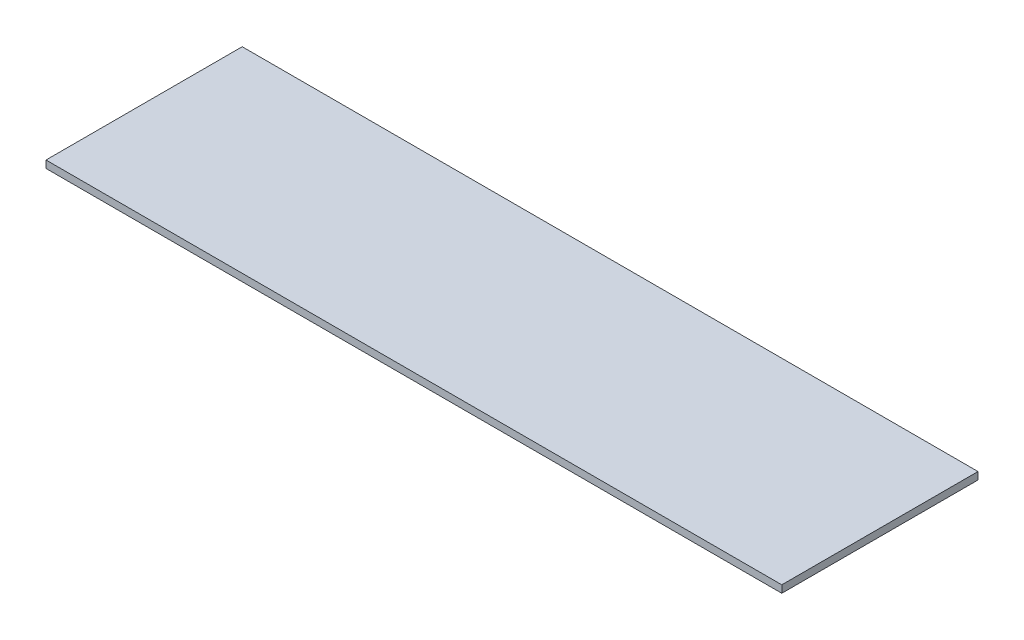
ISO-10303-21;
HEADER;
FILE_DESCRIPTION(('STEP AP214'),'2;1');
FILE_NAME('part.step','',(''),(''),'','','');
FILE_SCHEMA(('AUTOMOTIVE_DESIGN { 1 0 10303 214 1 1 1 1 }'));
ENDSEC;
DATA;
#1=APPLICATION_CONTEXT('core data for automotive mechanical design processes');
#2=APPLICATION_PROTOCOL_DEFINITION('international standard','automotive_design',2000,#1);
#3=PRODUCT_CONTEXT('',#1,'mechanical');
#4=PRODUCT('Part','Part','',(#3));
#5=PRODUCT_RELATED_PRODUCT_CATEGORY('part','',(#4));
#6=PRODUCT_DEFINITION_FORMATION('','',#4);
#7=PRODUCT_DEFINITION_CONTEXT('part definition',#1,'design');
#8=PRODUCT_DEFINITION('design','',#6,#7);
#9=PRODUCT_DEFINITION_SHAPE('','',#8);
#10=(LENGTH_UNIT() NAMED_UNIT(*) SI_UNIT(.MILLI.,.METRE.));
#11=(NAMED_UNIT(*) PLANE_ANGLE_UNIT() SI_UNIT($,.RADIAN.));
#12=(NAMED_UNIT(*) SI_UNIT($,.STERADIAN.) SOLID_ANGLE_UNIT());
#13=UNCERTAINTY_MEASURE_WITH_UNIT(LENGTH_MEASURE(1.E-05),#10,'distance_accuracy_value','');
#14=(GEOMETRIC_REPRESENTATION_CONTEXT(3) GLOBAL_UNCERTAINTY_ASSIGNED_CONTEXT((#13)) GLOBAL_UNIT_ASSIGNED_CONTEXT((#10,
#11,#12)) REPRESENTATION_CONTEXT('',''));
#15=CARTESIAN_POINT('',(0.,0.,0.));
#16=DIRECTION('',(0.,0.,1.));
#17=DIRECTION('',(1.,0.,0.));
#18=AXIS2_PLACEMENT_3D('',#15,#16,#17);
#19=CARTESIAN_POINT('',(150.,3.,40.));
#20=DIRECTION('',(-1.,0.,0.));
#21=DIRECTION('',(0.,0.,1.));
#22=AXIS2_PLACEMENT_3D('',#19,#20,#21);
#23=PLANE('',#22);
#24=DIRECTION('',(0.,0.,-1.));
#25=VECTOR('',#24,1.);
#26=CARTESIAN_POINT('',(150.,0.,40.));
#27=LINE('',#26,#25);
#28=CARTESIAN_POINT('',(150.,0.,40.));
#29=VERTEX_POINT('',#28);
#30=CARTESIAN_POINT('',(150.,0.,-40.));
#31=VERTEX_POINT('',#30);
#32=EDGE_CURVE('E100',#29,#31,#27,.T.);
#33=ORIENTED_EDGE('',*,*,#32,.T.);
#34=DIRECTION('',(0.,-1.,0.));
#35=VECTOR('',#34,1.);
#36=CARTESIAN_POINT('',(150.,3.,-40.));
#37=LINE('',#36,#35);
#38=CARTESIAN_POINT('',(150.,3.,-40.));
#39=VERTEX_POINT('',#38);
#40=EDGE_CURVE('E11',#39,#31,#37,.T.);
#41=ORIENTED_EDGE('',*,*,#40,.F.);
#42=DIRECTION('',(0.,0.,-1.));
#43=VECTOR('',#42,1.);
#44=CARTESIAN_POINT('',(150.,3.,40.));
#45=LINE('',#44,#43);
#46=CARTESIAN_POINT('',(150.,3.,40.));
#47=VERTEX_POINT('',#46);
#48=EDGE_CURVE('E88',#47,#39,#45,.T.);
#49=ORIENTED_EDGE('',*,*,#48,.F.);
#50=DIRECTION('',(0.,-1.,0.));
#51=VECTOR('',#50,1.);
#52=CARTESIAN_POINT('',(150.,3.,40.));
#53=LINE('',#52,#51);
#54=EDGE_CURVE('E96',#47,#29,#53,.T.);
#55=ORIENTED_EDGE('',*,*,#54,.T.);
#56=EDGE_LOOP('',(#33,#41,#49,#55));
#57=FACE_BOUND('',#56,.T.);
#58=ADVANCED_FACE('F37',(#57),#23,.F.);
#59=CARTESIAN_POINT('',(-150.,3.,-40.));
#60=DIRECTION('',(0.,0.,1.));
#61=DIRECTION('',(1.,0.,0.));
#62=AXIS2_PLACEMENT_3D('',#59,#60,#61);
#63=PLANE('',#62);
#64=DIRECTION('',(-1.,0.,0.));
#65=VECTOR('',#64,1.);
#66=CARTESIAN_POINT('',(-150.,0.,-40.));
#67=LINE('',#66,#65);
#68=CARTESIAN_POINT('',(-150.,0.,-40.));
#69=VERTEX_POINT('',#68);
#70=EDGE_CURVE('E92',#31,#69,#67,.T.);
#71=ORIENTED_EDGE('',*,*,#70,.T.);
#72=DIRECTION('',(0.,-1.,0.));
#73=VECTOR('',#72,1.);
#74=CARTESIAN_POINT('',(-150.,3.,-40.));
#75=LINE('',#74,#73);
#76=CARTESIAN_POINT('',(-150.,3.,-40.));
#77=VERTEX_POINT('',#76);
#78=EDGE_CURVE('E45',#77,#69,#75,.T.);
#79=ORIENTED_EDGE('',*,*,#78,.F.);
#80=DIRECTION('',(-1.,0.,0.));
#81=VECTOR('',#80,1.);
#82=CARTESIAN_POINT('',(-150.,3.,-40.));
#83=LINE('',#82,#81);
#84=EDGE_CURVE('E83',#39,#77,#83,.T.);
#85=ORIENTED_EDGE('',*,*,#84,.F.);
#86=ORIENTED_EDGE('',*,*,#40,.T.);
#87=EDGE_LOOP('',(#71,#79,#85,#86));
#88=FACE_BOUND('',#87,.T.);
#89=ADVANCED_FACE('F91',(#88),#63,.F.);
#90=CARTESIAN_POINT('',(-150.,3.,40.));
#91=DIRECTION('',(1.,0.,0.));
#92=DIRECTION('',(0.,0.,-1.));
#93=AXIS2_PLACEMENT_3D('',#90,#91,#92);
#94=PLANE('',#93);
#95=DIRECTION('',(0.,0.,1.));
#96=VECTOR('',#95,1.);
#97=CARTESIAN_POINT('',(-150.,0.,40.));
#98=LINE('',#97,#96);
#99=CARTESIAN_POINT('',(-150.,0.,40.));
#100=VERTEX_POINT('',#99);
#101=EDGE_CURVE('E70',#69,#100,#98,.T.);
#102=ORIENTED_EDGE('',*,*,#101,.T.);
#103=DIRECTION('',(0.,-1.,0.));
#104=VECTOR('',#103,1.);
#105=CARTESIAN_POINT('',(-150.,3.,40.));
#106=LINE('',#105,#104);
#107=CARTESIAN_POINT('',(-150.,3.,40.));
#108=VERTEX_POINT('',#107);
#109=EDGE_CURVE('E93',#108,#100,#106,.T.);
#110=ORIENTED_EDGE('',*,*,#109,.F.);
#111=DIRECTION('',(0.,0.,1.));
#112=VECTOR('',#111,1.);
#113=CARTESIAN_POINT('',(-150.,3.,40.));
#114=LINE('',#113,#112);
#115=EDGE_CURVE('E86',#77,#108,#114,.T.);
#116=ORIENTED_EDGE('',*,*,#115,.F.);
#117=ORIENTED_EDGE('',*,*,#78,.T.);
#118=EDGE_LOOP('',(#102,#110,#116,#117));
#119=FACE_BOUND('',#118,.T.);
#120=ADVANCED_FACE('F94',(#119),#94,.F.);
#121=CARTESIAN_POINT('',(-150.,3.,40.));
#122=DIRECTION('',(0.,0.,-1.));
#123=DIRECTION('',(-1.,0.,0.));
#124=AXIS2_PLACEMENT_3D('',#121,#122,#123);
#125=PLANE('',#124);
#126=DIRECTION('',(1.,0.,0.));
#127=VECTOR('',#126,1.);
#128=CARTESIAN_POINT('',(-150.,0.,40.));
#129=LINE('',#128,#127);
#130=EDGE_CURVE('E76',#100,#29,#129,.T.);
#131=ORIENTED_EDGE('',*,*,#130,.T.);
#132=ORIENTED_EDGE('',*,*,#54,.F.);
#133=DIRECTION('',(1.,0.,0.));
#134=VECTOR('',#133,1.);
#135=CARTESIAN_POINT('',(-150.,3.,40.));
#136=LINE('',#135,#134);
#137=EDGE_CURVE('E53',#108,#47,#136,.T.);
#138=ORIENTED_EDGE('',*,*,#137,.F.);
#139=ORIENTED_EDGE('',*,*,#109,.T.);
#140=EDGE_LOOP('',(#131,#132,#138,#139));
#141=FACE_BOUND('',#140,.T.);
#142=ADVANCED_FACE('F107',(#141),#125,.F.);
#143=CARTESIAN_POINT('',(0.,3.,0.));
#144=DIRECTION('',(0.,-1.,0.));
#145=DIRECTION('',(0.,0.,-1.));
#146=AXIS2_PLACEMENT_3D('',#143,#144,#145);
#147=PLANE('',#146);
#148=ORIENTED_EDGE('',*,*,#48,.T.);
#149=ORIENTED_EDGE('',*,*,#84,.T.);
#150=ORIENTED_EDGE('',*,*,#115,.T.);
#151=ORIENTED_EDGE('',*,*,#137,.T.);
#152=EDGE_LOOP('',(#148,#149,#150,#151));
#153=FACE_BOUND('',#152,.T.);
#154=ADVANCED_FACE('F84',(#153),#147,.F.);
#155=CARTESIAN_POINT('',(0.,0.,0.));
#156=DIRECTION('',(0.,-1.,0.));
#157=DIRECTION('',(0.,0.,-1.));
#158=AXIS2_PLACEMENT_3D('',#155,#156,#157);
#159=PLANE('',#158);
#160=ORIENTED_EDGE('',*,*,#32,.F.);
#161=ORIENTED_EDGE('',*,*,#130,.F.);
#162=ORIENTED_EDGE('',*,*,#101,.F.);
#163=ORIENTED_EDGE('',*,*,#70,.F.);
#164=EDGE_LOOP('',(#160,#161,#162,#163));
#165=FACE_BOUND('',#164,.T.);
#166=ADVANCED_FACE('F110',(#165),#159,.T.);
#167=CLOSED_SHELL('',(#58,#89,#120,#142,#154,#166));
#168=MANIFOLD_SOLID_BREP('B2',#167);
#169=ADVANCED_BREP_SHAPE_REPRESENTATION('',(#18,#168),#14);
#170=SHAPE_DEFINITION_REPRESENTATION(#9,#169);
ENDSEC;
END-ISO-10303-21;
